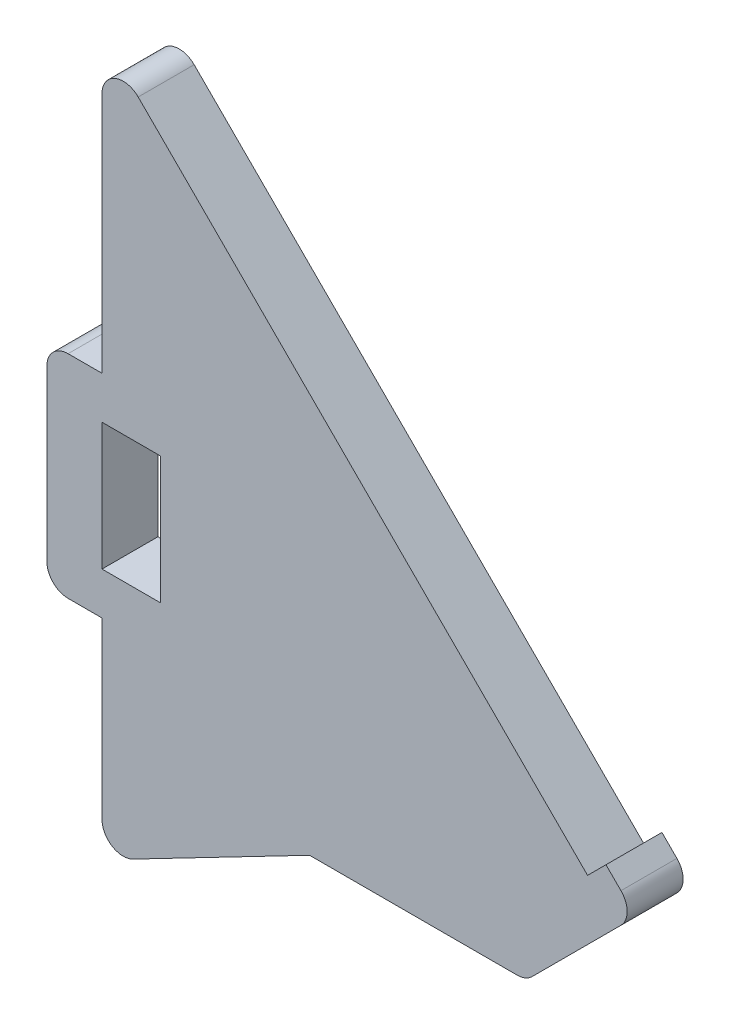
ISO-10303-21;
HEADER;
FILE_DESCRIPTION(('STEP AP214'),'2;1');
FILE_NAME('part.step','',(''),(''),'','','');
FILE_SCHEMA(('AUTOMOTIVE_DESIGN { 1 0 10303 214 1 1 1 1 }'));
ENDSEC;
DATA;
#1=APPLICATION_CONTEXT('core data for automotive mechanical design processes');
#2=APPLICATION_PROTOCOL_DEFINITION('international standard','automotive_design',2000,#1);
#3=PRODUCT_CONTEXT('',#1,'mechanical');
#4=PRODUCT('Part','Part','',(#3));
#5=PRODUCT_RELATED_PRODUCT_CATEGORY('part','',(#4));
#6=PRODUCT_DEFINITION_FORMATION('','',#4);
#7=PRODUCT_DEFINITION_CONTEXT('part definition',#1,'design');
#8=PRODUCT_DEFINITION('design','',#6,#7);
#9=PRODUCT_DEFINITION_SHAPE('','',#8);
#10=(LENGTH_UNIT() NAMED_UNIT(*) SI_UNIT(.MILLI.,.METRE.));
#11=(NAMED_UNIT(*) PLANE_ANGLE_UNIT() SI_UNIT($,.RADIAN.));
#12=(NAMED_UNIT(*) SI_UNIT($,.STERADIAN.) SOLID_ANGLE_UNIT());
#13=UNCERTAINTY_MEASURE_WITH_UNIT(LENGTH_MEASURE(1.E-05),#10,'distance_accuracy_value','');
#14=(GEOMETRIC_REPRESENTATION_CONTEXT(3) GLOBAL_UNCERTAINTY_ASSIGNED_CONTEXT((#13)) GLOBAL_UNIT_ASSIGNED_CONTEXT((#10,
#11,#12)) REPRESENTATION_CONTEXT('',''));
#15=CARTESIAN_POINT('',(0.,0.,0.));
#16=DIRECTION('',(0.,0.,1.));
#17=DIRECTION('',(1.,0.,0.));
#18=AXIS2_PLACEMENT_3D('',#15,#16,#17);
#19=CARTESIAN_POINT('',(-4.,-57.1223663641,6.6));
#20=DIRECTION('',(0.,0.,1.));
#21=DIRECTION('',(1.,0.,0.));
#22=AXIS2_PLACEMENT_3D('',#19,#20,#21);
#23=PLANE('',#22);
#24=CARTESIAN_POINT('',(-4.,-57.1223663641,6.6));
#25=DIRECTION('',(0.,0.,1.));
#26=DIRECTION('',(1.,0.,0.));
#27=AXIS2_PLACEMENT_3D('',#24,#25,#26);
#28=CIRCLE('',#27,2.5);
#29=CARTESIAN_POINT('',(-6.5,-57.1223663641,6.6));
#30=VERTEX_POINT('',#29);
#31=CARTESIAN_POINT('',(-4.,-59.6223663641,6.6));
#32=VERTEX_POINT('',#31);
#33=EDGE_CURVE('E212',#30,#32,#28,.T.);
#34=ORIENTED_EDGE('',*,*,#33,.T.);
#35=DIRECTION('',(1.,0.,0.));
#36=VECTOR('',#35,1.);
#37=CARTESIAN_POINT('',(0.,-59.6223663641,6.6));
#38=LINE('',#37,#36);
#39=CARTESIAN_POINT('',(0.,-59.6223663641,6.6));
#40=VERTEX_POINT('',#39);
#41=EDGE_CURVE('E215',#32,#40,#38,.T.);
#42=ORIENTED_EDGE('',*,*,#41,.T.);
#43=DIRECTION('',(0.,-1.,0.));
#44=VECTOR('',#43,1.);
#45=CARTESIAN_POINT('',(0.,-59.6223663641,6.6));
#46=LINE('',#45,#44);
#47=CARTESIAN_POINT('',(0.,-80.2091547881,6.6));
#48=VERTEX_POINT('',#47);
#49=EDGE_CURVE('E218',#40,#48,#46,.T.);
#50=ORIENTED_EDGE('',*,*,#49,.T.);
#51=CARTESIAN_POINT('',(2.50000000000002,-80.2091547881403,6.6));
#52=DIRECTION('',(0.,0.,1.));
#53=DIRECTION('',(1.,0.,0.));
#54=AXIS2_PLACEMENT_3D('',#51,#52,#53);
#55=CIRCLE('',#54,2.50000000000002);
#56=CARTESIAN_POINT('',(3.6511864286,-82.4283370264,6.6));
#57=VERTEX_POINT('',#56);
#58=EDGE_CURVE('E220',#48,#57,#55,.T.);
#59=ORIENTED_EDGE('',*,*,#58,.T.);
#60=DIRECTION('',(0.887672895301549,0.460474571444466,0.));
#61=VECTOR('',#60,1.);
#62=CARTESIAN_POINT('',(24.482233047,-71.6223663641,6.6));
#63=LINE('',#62,#61);
#64=CARTESIAN_POINT('',(24.482233047,-71.6223663641,6.6));
#65=VERTEX_POINT('',#64);
#66=EDGE_CURVE('E222',#57,#65,#63,.T.);
#67=ORIENTED_EDGE('',*,*,#66,.T.);
#68=DIRECTION('',(1.,0.,0.));
#69=VECTOR('',#68,1.);
#70=CARTESIAN_POINT('',(24.482233047,-71.6223663641,6.6));
#71=LINE('',#70,#69);
#72=CARTESIAN_POINT('',(48.9644660941,-71.6223663641,6.6));
#73=VERTEX_POINT('',#72);
#74=EDGE_CURVE('E224',#65,#73,#71,.T.);
#75=ORIENTED_EDGE('',*,*,#74,.T.);
#76=CARTESIAN_POINT('',(48.9644660940673,-69.1223663641001,6.6));
#77=DIRECTION('',(0.,0.,1.));
#78=DIRECTION('',(1.,0.,0.));
#79=AXIS2_PLACEMENT_3D('',#76,#77,#78);
#80=CIRCLE('',#79,2.49999999999995);
#81=CARTESIAN_POINT('',(50.732233047,-70.8901333171,6.6));
#82=VERTEX_POINT('',#81);
#83=EDGE_CURVE('E226',#73,#82,#80,.T.);
#84=ORIENTED_EDGE('',*,*,#83,.T.);
#85=DIRECTION('',(0.707106781186548,0.707106781186547,0.));
#86=VECTOR('',#85,1.);
#87=CARTESIAN_POINT('',(50.732233047,-70.8901333171,6.6));
#88=LINE('',#87,#86);
#89=CARTESIAN_POINT('',(61.2142340473,-60.4081323168,6.6));
#90=VERTEX_POINT('',#89);
#91=EDGE_CURVE('E228',#82,#90,#88,.T.);
#92=ORIENTED_EDGE('',*,*,#91,.T.);
#93=CARTESIAN_POINT('',(59.4464670943673,-58.6403653638,6.6));
#94=DIRECTION('',(0.,0.,1.));
#95=DIRECTION('',(1.,0.,0.));
#96=AXIS2_PLACEMENT_3D('',#93,#94,#95);
#97=CIRCLE('',#96,2.49999999999999);
#98=CARTESIAN_POINT('',(61.2142340473,-56.8725984108,6.6));
#99=VERTEX_POINT('',#98);
#100=EDGE_CURVE('E230',#90,#99,#97,.T.);
#101=ORIENTED_EDGE('',*,*,#100,.T.);
#102=DIRECTION('',(-0.707106781186548,0.707106781186548,0.));
#103=VECTOR('',#102,1.);
#104=CARTESIAN_POINT('',(61.2142340473,-56.8725984108,6.6));
#105=LINE('',#104,#103);
#106=CARTESIAN_POINT('',(59.4464670944,-55.1048314579,6.6));
#107=VERTEX_POINT('',#106);
#108=EDGE_CURVE('E232',#99,#107,#105,.T.);
#109=ORIENTED_EDGE('',*,*,#108,.T.);
#110=DIRECTION('',(-0.707106781202832,-0.707106781170263,0.));
#111=VECTOR('',#110,1.);
#112=CARTESIAN_POINT('',(59.4464670944,-55.1048314579,6.6));
#113=LINE('',#112,#111);
#114=CARTESIAN_POINT('',(57.2756492761,-57.2756492761,6.6));
#115=VERTEX_POINT('',#114);
#116=EDGE_CURVE('E234',#107,#115,#113,.T.);
#117=ORIENTED_EDGE('',*,*,#116,.T.);
#118=DIRECTION('',(-0.707106781186548,0.707106781186548,0.));
#119=VECTOR('',#118,1.);
#120=CARTESIAN_POINT('',(57.2756492761,-57.2756492761,6.6));
#121=LINE('',#120,#119);
#122=CARTESIAN_POINT('',(4.267766953,-4.267766953,6.6));
#123=VERTEX_POINT('',#122);
#124=EDGE_CURVE('E236',#115,#123,#121,.T.);
#125=ORIENTED_EDGE('',*,*,#124,.T.);
#126=CARTESIAN_POINT('',(2.5,-6.03553390593274,6.6));
#127=DIRECTION('',(0.,0.,1.));
#128=DIRECTION('',(1.,0.,0.));
#129=AXIS2_PLACEMENT_3D('',#126,#127,#128);
#130=CIRCLE('',#129,2.5);
#131=CARTESIAN_POINT('',(0.,-6.0355339059,6.6));
#132=VERTEX_POINT('',#131);
#133=EDGE_CURVE('E238',#123,#132,#130,.T.);
#134=ORIENTED_EDGE('',*,*,#133,.T.);
#135=DIRECTION('',(0.,-1.,0.));
#136=VECTOR('',#135,1.);
#137=CARTESIAN_POINT('',(0.,-6.0355339059,6.6));
#138=LINE('',#137,#136);
#139=CARTESIAN_POINT('',(0.,-34.6223663641,6.6));
#140=VERTEX_POINT('',#139);
#141=EDGE_CURVE('E240',#132,#140,#138,.T.);
#142=ORIENTED_EDGE('',*,*,#141,.T.);
#143=DIRECTION('',(-1.,0.,0.));
#144=VECTOR('',#143,1.);
#145=CARTESIAN_POINT('',(-4.,-34.6223663641,6.6));
#146=LINE('',#145,#144);
#147=CARTESIAN_POINT('',(-4.,-34.6223663641,6.6));
#148=VERTEX_POINT('',#147);
#149=EDGE_CURVE('E242',#140,#148,#146,.T.);
#150=ORIENTED_EDGE('',*,*,#149,.T.);
#151=CARTESIAN_POINT('',(-4.,-37.1223663641,6.6));
#152=DIRECTION('',(0.,0.,1.));
#153=DIRECTION('',(1.,0.,0.));
#154=AXIS2_PLACEMENT_3D('',#151,#152,#153);
#155=CIRCLE('',#154,2.5);
#156=CARTESIAN_POINT('',(-6.5,-37.1223663641,6.6));
#157=VERTEX_POINT('',#156);
#158=EDGE_CURVE('E244',#148,#157,#155,.T.);
#159=ORIENTED_EDGE('',*,*,#158,.T.);
#160=DIRECTION('',(0.,-1.,0.));
#161=VECTOR('',#160,1.);
#162=CARTESIAN_POINT('',(-6.5,-57.1223663641,6.6));
#163=LINE('',#162,#161);
#164=EDGE_CURVE('E246',#157,#30,#163,.T.);
#165=ORIENTED_EDGE('',*,*,#164,.T.);
#166=EDGE_LOOP('',(#34,#42,#50,#59,#67,#75,#84,#92,#101,#109,#117,#125,#134,#142,#150,#159,#165));
#167=FACE_BOUND('',#166,.T.);
#168=DIRECTION('',(-1.,0.,0.));
#169=VECTOR('',#168,1.);
#170=CARTESIAN_POINT('',(6.88,-39.6223663641,6.6));
#171=LINE('',#170,#169);
#172=CARTESIAN_POINT('',(6.88,-39.6223663641,6.6));
#173=VERTEX_POINT('',#172);
#174=CARTESIAN_POINT('',(0.,-39.6223663641,6.6));
#175=VERTEX_POINT('',#174);
#176=EDGE_CURVE('E184',#173,#175,#171,.T.);
#177=ORIENTED_EDGE('',*,*,#176,.F.);
#178=DIRECTION('',(0.,1.,0.));
#179=VECTOR('',#178,1.);
#180=CARTESIAN_POINT('',(6.88,-54.6223663641,6.6));
#181=LINE('',#180,#179);
#182=CARTESIAN_POINT('',(6.88,-54.6223663641,6.6));
#183=VERTEX_POINT('',#182);
#184=EDGE_CURVE('E176',#183,#173,#181,.T.);
#185=ORIENTED_EDGE('',*,*,#184,.F.);
#186=DIRECTION('',(1.,0.,0.));
#187=VECTOR('',#186,1.);
#188=CARTESIAN_POINT('',(0.,-54.6223663641,6.6));
#189=LINE('',#188,#187);
#190=CARTESIAN_POINT('',(0.,-54.6223663641,6.6));
#191=VERTEX_POINT('',#190);
#192=EDGE_CURVE('E198',#191,#183,#189,.T.);
#193=ORIENTED_EDGE('',*,*,#192,.F.);
#194=DIRECTION('',(0.,-1.,0.));
#195=VECTOR('',#194,1.);
#196=CARTESIAN_POINT('',(0.,-39.6223663641,6.6));
#197=LINE('',#196,#195);
#198=EDGE_CURVE('E196',#175,#191,#197,.T.);
#199=ORIENTED_EDGE('',*,*,#198,.F.);
#200=EDGE_LOOP('',(#177,#185,#193,#199));
#201=FACE_BOUND('',#200,.T.);
#202=ADVANCED_FACE('F33',(#167,#201),#23,.T.);
#203=CARTESIAN_POINT('',(-4.,-57.1223663641,0.));
#204=DIRECTION('',(0.,0.,1.));
#205=DIRECTION('',(1.,0.,0.));
#206=AXIS2_PLACEMENT_3D('',#203,#204,#205);
#207=PLANE('',#206);
#208=CARTESIAN_POINT('',(-4.,-57.1223663641,0.));
#209=DIRECTION('',(0.,0.,1.));
#210=DIRECTION('',(1.,0.,0.));
#211=AXIS2_PLACEMENT_3D('',#208,#209,#210);
#212=CIRCLE('',#211,2.5);
#213=CARTESIAN_POINT('',(-6.5,-57.1223663641,0.));
#214=VERTEX_POINT('',#213);
#215=CARTESIAN_POINT('',(-4.,-59.6223663641,0.));
#216=VERTEX_POINT('',#215);
#217=EDGE_CURVE('E192',#214,#216,#212,.T.);
#218=ORIENTED_EDGE('',*,*,#217,.F.);
#219=DIRECTION('',(0.,-1.,0.));
#220=VECTOR('',#219,1.);
#221=CARTESIAN_POINT('',(-6.5,-57.1223663641,0.));
#222=LINE('',#221,#220);
#223=CARTESIAN_POINT('',(-6.5,-37.1223663641,0.));
#224=VERTEX_POINT('',#223);
#225=EDGE_CURVE('E216',#224,#214,#222,.T.);
#226=ORIENTED_EDGE('',*,*,#225,.F.);
#227=CARTESIAN_POINT('',(-4.,-37.1223663641,0.));
#228=DIRECTION('',(0.,0.,1.));
#229=DIRECTION('',(1.,0.,0.));
#230=AXIS2_PLACEMENT_3D('',#227,#228,#229);
#231=CIRCLE('',#230,2.5);
#232=CARTESIAN_POINT('',(-4.,-34.6223663641,0.));
#233=VERTEX_POINT('',#232);
#234=EDGE_CURVE('E279',#233,#224,#231,.T.);
#235=ORIENTED_EDGE('',*,*,#234,.F.);
#236=DIRECTION('',(-1.,0.,0.));
#237=VECTOR('',#236,1.);
#238=CARTESIAN_POINT('',(-4.,-34.6223663641,0.));
#239=LINE('',#238,#237);
#240=CARTESIAN_POINT('',(0.,-34.6223663641,0.));
#241=VERTEX_POINT('',#240);
#242=EDGE_CURVE('E277',#241,#233,#239,.T.);
#243=ORIENTED_EDGE('',*,*,#242,.F.);
#244=DIRECTION('',(0.,-1.,0.));
#245=VECTOR('',#244,1.);
#246=CARTESIAN_POINT('',(0.,-6.0355339059,0.));
#247=LINE('',#246,#245);
#248=CARTESIAN_POINT('',(0.,-6.0355339059,0.));
#249=VERTEX_POINT('',#248);
#250=EDGE_CURVE('E275',#249,#241,#247,.T.);
#251=ORIENTED_EDGE('',*,*,#250,.F.);
#252=CARTESIAN_POINT('',(2.5,-6.03553390593274,0.));
#253=DIRECTION('',(0.,0.,1.));
#254=DIRECTION('',(1.,0.,0.));
#255=AXIS2_PLACEMENT_3D('',#252,#253,#254);
#256=CIRCLE('',#255,2.5);
#257=CARTESIAN_POINT('',(4.267766953,-4.267766953,0.));
#258=VERTEX_POINT('',#257);
#259=EDGE_CURVE('E273',#258,#249,#256,.T.);
#260=ORIENTED_EDGE('',*,*,#259,.F.);
#261=DIRECTION('',(-0.707106781186548,0.707106781186548,0.));
#262=VECTOR('',#261,1.);
#263=CARTESIAN_POINT('',(57.2756492761,-57.2756492761,0.));
#264=LINE('',#263,#262);
#265=CARTESIAN_POINT('',(57.2756492761,-57.2756492761,0.));
#266=VERTEX_POINT('',#265);
#267=EDGE_CURVE('E271',#266,#258,#264,.T.);
#268=ORIENTED_EDGE('',*,*,#267,.F.);
#269=DIRECTION('',(-0.707106781202832,-0.707106781170263,0.));
#270=VECTOR('',#269,1.);
#271=CARTESIAN_POINT('',(59.4464670944,-55.1048314579,0.));
#272=LINE('',#271,#270);
#273=CARTESIAN_POINT('',(59.4464670944,-55.1048314579,0.));
#274=VERTEX_POINT('',#273);
#275=EDGE_CURVE('E269',#274,#266,#272,.T.);
#276=ORIENTED_EDGE('',*,*,#275,.F.);
#277=DIRECTION('',(-0.707106781186548,0.707106781186548,0.));
#278=VECTOR('',#277,1.);
#279=CARTESIAN_POINT('',(61.2142340473,-56.8725984108,0.));
#280=LINE('',#279,#278);
#281=CARTESIAN_POINT('',(61.2142340473,-56.8725984108,0.));
#282=VERTEX_POINT('',#281);
#283=EDGE_CURVE('E267',#282,#274,#280,.T.);
#284=ORIENTED_EDGE('',*,*,#283,.F.);
#285=CARTESIAN_POINT('',(59.4464670943673,-58.6403653638,0.));
#286=DIRECTION('',(0.,0.,1.));
#287=DIRECTION('',(1.,0.,0.));
#288=AXIS2_PLACEMENT_3D('',#285,#286,#287);
#289=CIRCLE('',#288,2.49999999999999);
#290=CARTESIAN_POINT('',(61.2142340473,-60.4081323168,0.));
#291=VERTEX_POINT('',#290);
#292=EDGE_CURVE('E265',#291,#282,#289,.T.);
#293=ORIENTED_EDGE('',*,*,#292,.F.);
#294=DIRECTION('',(0.707106781186548,0.707106781186547,0.));
#295=VECTOR('',#294,1.);
#296=CARTESIAN_POINT('',(50.732233047,-70.8901333171,0.));
#297=LINE('',#296,#295);
#298=CARTESIAN_POINT('',(50.732233047,-70.8901333171,0.));
#299=VERTEX_POINT('',#298);
#300=EDGE_CURVE('E263',#299,#291,#297,.T.);
#301=ORIENTED_EDGE('',*,*,#300,.F.);
#302=CARTESIAN_POINT('',(48.9644660940673,-69.1223663641001,0.));
#303=DIRECTION('',(0.,0.,1.));
#304=DIRECTION('',(1.,0.,0.));
#305=AXIS2_PLACEMENT_3D('',#302,#303,#304);
#306=CIRCLE('',#305,2.49999999999995);
#307=CARTESIAN_POINT('',(48.9644660941,-71.6223663641,0.));
#308=VERTEX_POINT('',#307);
#309=EDGE_CURVE('E261',#308,#299,#306,.T.);
#310=ORIENTED_EDGE('',*,*,#309,.F.);
#311=DIRECTION('',(1.,0.,0.));
#312=VECTOR('',#311,1.);
#313=CARTESIAN_POINT('',(24.482233047,-71.6223663641,0.));
#314=LINE('',#313,#312);
#315=CARTESIAN_POINT('',(24.482233047,-71.6223663641,0.));
#316=VERTEX_POINT('',#315);
#317=EDGE_CURVE('E259',#316,#308,#314,.T.);
#318=ORIENTED_EDGE('',*,*,#317,.F.);
#319=DIRECTION('',(0.887672895301549,0.460474571444466,0.));
#320=VECTOR('',#319,1.);
#321=CARTESIAN_POINT('',(24.482233047,-71.6223663641,0.));
#322=LINE('',#321,#320);
#323=CARTESIAN_POINT('',(3.6511864286,-82.4283370264,0.));
#324=VERTEX_POINT('',#323);
#325=EDGE_CURVE('E257',#324,#316,#322,.T.);
#326=ORIENTED_EDGE('',*,*,#325,.F.);
#327=CARTESIAN_POINT('',(2.50000000000002,-80.2091547881403,0.));
#328=DIRECTION('',(0.,0.,1.));
#329=DIRECTION('',(1.,0.,0.));
#330=AXIS2_PLACEMENT_3D('',#327,#328,#329);
#331=CIRCLE('',#330,2.50000000000002);
#332=CARTESIAN_POINT('',(0.,-80.2091547881,0.));
#333=VERTEX_POINT('',#332);
#334=EDGE_CURVE('E255',#333,#324,#331,.T.);
#335=ORIENTED_EDGE('',*,*,#334,.F.);
#336=DIRECTION('',(0.,-1.,0.));
#337=VECTOR('',#336,1.);
#338=CARTESIAN_POINT('',(0.,-59.6223663641,0.));
#339=LINE('',#338,#337);
#340=CARTESIAN_POINT('',(0.,-59.6223663641,0.));
#341=VERTEX_POINT('',#340);
#342=EDGE_CURVE('E253',#341,#333,#339,.T.);
#343=ORIENTED_EDGE('',*,*,#342,.F.);
#344=DIRECTION('',(1.,0.,0.));
#345=VECTOR('',#344,1.);
#346=CARTESIAN_POINT('',(0.,-59.6223663641,0.));
#347=LINE('',#346,#345);
#348=EDGE_CURVE('E251',#216,#341,#347,.T.);
#349=ORIENTED_EDGE('',*,*,#348,.F.);
#350=EDGE_LOOP('',(#218,#226,#235,#243,#251,#260,#268,#276,#284,#293,#301,#310,#318,#326,#335,
#343,#349));
#351=FACE_BOUND('',#350,.T.);
#352=DIRECTION('',(0.,1.,0.));
#353=VECTOR('',#352,1.);
#354=CARTESIAN_POINT('',(6.88,-54.6223663641,0.));
#355=LINE('',#354,#353);
#356=CARTESIAN_POINT('',(6.88,-54.6223663641,0.));
#357=VERTEX_POINT('',#356);
#358=CARTESIAN_POINT('',(6.88,-39.6223663641,0.));
#359=VERTEX_POINT('',#358);
#360=EDGE_CURVE('E56',#357,#359,#355,.T.);
#361=ORIENTED_EDGE('',*,*,#360,.T.);
#362=DIRECTION('',(-1.,0.,0.));
#363=VECTOR('',#362,1.);
#364=CARTESIAN_POINT('',(6.88,-39.6223663641,0.));
#365=LINE('',#364,#363);
#366=CARTESIAN_POINT('',(0.,-39.6223663641,0.));
#367=VERTEX_POINT('',#366);
#368=EDGE_CURVE('E191',#359,#367,#365,.T.);
#369=ORIENTED_EDGE('',*,*,#368,.T.);
#370=DIRECTION('',(0.,-1.,0.));
#371=VECTOR('',#370,1.);
#372=CARTESIAN_POINT('',(0.,-39.6223663641,0.));
#373=LINE('',#372,#371);
#374=CARTESIAN_POINT('',(0.,-54.6223663641,0.));
#375=VERTEX_POINT('',#374);
#376=EDGE_CURVE('E204',#367,#375,#373,.T.);
#377=ORIENTED_EDGE('',*,*,#376,.T.);
#378=DIRECTION('',(1.,0.,0.));
#379=VECTOR('',#378,1.);
#380=CARTESIAN_POINT('',(0.,-54.6223663641,0.));
#381=LINE('',#380,#379);
#382=EDGE_CURVE('E185',#375,#357,#381,.T.);
#383=ORIENTED_EDGE('',*,*,#382,.T.);
#384=EDGE_LOOP('',(#361,#369,#377,#383));
#385=FACE_BOUND('',#384,.T.);
#386=ADVANCED_FACE('F336',(#351,#385),#207,.F.);
#387=CARTESIAN_POINT('',(-4.,-57.1223663641,6.6));
#388=DIRECTION('',(0.,0.,-1.));
#389=DIRECTION('',(-1.,0.,0.));
#390=AXIS2_PLACEMENT_3D('',#387,#388,#389);
#391=CYLINDRICAL_SURFACE('',#390,2.5);
#392=ORIENTED_EDGE('',*,*,#217,.T.);
#393=DIRECTION('',(0.,0.,-1.));
#394=VECTOR('',#393,1.);
#395=CARTESIAN_POINT('',(-4.,-59.6223663641,6.6));
#396=LINE('',#395,#394);
#397=EDGE_CURVE('E11',#32,#216,#396,.T.);
#398=ORIENTED_EDGE('',*,*,#397,.F.);
#399=ORIENTED_EDGE('',*,*,#33,.F.);
#400=DIRECTION('',(0.,0.,-1.));
#401=VECTOR('',#400,1.);
#402=CARTESIAN_POINT('',(-6.5,-57.1223663641,6.6));
#403=LINE('',#402,#401);
#404=EDGE_CURVE('E248',#30,#214,#403,.T.);
#405=ORIENTED_EDGE('',*,*,#404,.T.);
#406=EDGE_LOOP('',(#392,#398,#399,#405));
#407=FACE_BOUND('',#406,.T.);
#408=ADVANCED_FACE('F35',(#407),#391,.T.);
#409=CARTESIAN_POINT('',(0.,-59.6223663641,6.6));
#410=DIRECTION('',(0.,1.,0.));
#411=DIRECTION('',(0.,0.,1.));
#412=AXIS2_PLACEMENT_3D('',#409,#410,#411);
#413=PLANE('',#412);
#414=ORIENTED_EDGE('',*,*,#348,.T.);
#415=DIRECTION('',(0.,0.,-1.));
#416=VECTOR('',#415,1.);
#417=CARTESIAN_POINT('',(0.,-59.6223663641,6.6));
#418=LINE('',#417,#416);
#419=EDGE_CURVE('E41',#40,#341,#418,.T.);
#420=ORIENTED_EDGE('',*,*,#419,.F.);
#421=ORIENTED_EDGE('',*,*,#41,.F.);
#422=ORIENTED_EDGE('',*,*,#397,.T.);
#423=EDGE_LOOP('',(#414,#420,#421,#422));
#424=FACE_BOUND('',#423,.T.);
#425=ADVANCED_FACE('F353',(#424),#413,.F.);
#426=CARTESIAN_POINT('',(0.,-59.6223663641,6.6));
#427=DIRECTION('',(1.,0.,0.));
#428=DIRECTION('',(0.,0.,-1.));
#429=AXIS2_PLACEMENT_3D('',#426,#427,#428);
#430=PLANE('',#429);
#431=ORIENTED_EDGE('',*,*,#342,.T.);
#432=DIRECTION('',(0.,0.,-1.));
#433=VECTOR('',#432,1.);
#434=CARTESIAN_POINT('',(0.,-80.2091547881,6.6));
#435=LINE('',#434,#433);
#436=EDGE_CURVE('E323',#48,#333,#435,.T.);
#437=ORIENTED_EDGE('',*,*,#436,.F.);
#438=ORIENTED_EDGE('',*,*,#49,.F.);
#439=ORIENTED_EDGE('',*,*,#419,.T.);
#440=EDGE_LOOP('',(#431,#437,#438,#439));
#441=FACE_BOUND('',#440,.T.);
#442=ADVANCED_FACE('F330',(#441),#430,.F.);
#443=CARTESIAN_POINT('',(2.50000000000002,-80.2091547881403,6.6));
#444=DIRECTION('',(0.,0.,-1.));
#445=DIRECTION('',(-1.,0.,0.));
#446=AXIS2_PLACEMENT_3D('',#443,#444,#445);
#447=CYLINDRICAL_SURFACE('',#446,2.50000000000002);
#448=ORIENTED_EDGE('',*,*,#334,.T.);
#449=DIRECTION('',(0.,0.,-1.));
#450=VECTOR('',#449,1.);
#451=CARTESIAN_POINT('',(3.6511864286,-82.4283370264,6.6));
#452=LINE('',#451,#450);
#453=EDGE_CURVE('E320',#57,#324,#452,.T.);
#454=ORIENTED_EDGE('',*,*,#453,.F.);
#455=ORIENTED_EDGE('',*,*,#58,.F.);
#456=ORIENTED_EDGE('',*,*,#436,.T.);
#457=EDGE_LOOP('',(#448,#454,#455,#456));
#458=FACE_BOUND('',#457,.T.);
#459=ADVANCED_FACE('F342',(#458),#447,.T.);
#460=CARTESIAN_POINT('',(24.482233047,-71.6223663641,6.6));
#461=DIRECTION('',(-0.460474571444466,0.887672895301549,0.));
#462=DIRECTION('',(-0.887672895301549,-0.460474571444466,0.));
#463=AXIS2_PLACEMENT_3D('',#460,#461,#462);
#464=PLANE('',#463);
#465=ORIENTED_EDGE('',*,*,#325,.T.);
#466=DIRECTION('',(0.,0.,-1.));
#467=VECTOR('',#466,1.);
#468=CARTESIAN_POINT('',(24.482233047,-71.6223663641,6.6));
#469=LINE('',#468,#467);
#470=EDGE_CURVE('E317',#65,#316,#469,.T.);
#471=ORIENTED_EDGE('',*,*,#470,.F.);
#472=ORIENTED_EDGE('',*,*,#66,.F.);
#473=ORIENTED_EDGE('',*,*,#453,.T.);
#474=EDGE_LOOP('',(#465,#471,#472,#473));
#475=FACE_BOUND('',#474,.T.);
#476=ADVANCED_FACE('F346',(#475),#464,.F.);
#477=CARTESIAN_POINT('',(24.482233047,-71.6223663641,6.6));
#478=DIRECTION('',(0.,1.,0.));
#479=DIRECTION('',(0.,0.,1.));
#480=AXIS2_PLACEMENT_3D('',#477,#478,#479);
#481=PLANE('',#480);
#482=ORIENTED_EDGE('',*,*,#317,.T.);
#483=DIRECTION('',(0.,0.,-1.));
#484=VECTOR('',#483,1.);
#485=CARTESIAN_POINT('',(48.9644660941,-71.6223663641,6.6));
#486=LINE('',#485,#484);
#487=EDGE_CURVE('E314',#73,#308,#486,.T.);
#488=ORIENTED_EDGE('',*,*,#487,.F.);
#489=ORIENTED_EDGE('',*,*,#74,.F.);
#490=ORIENTED_EDGE('',*,*,#470,.T.);
#491=EDGE_LOOP('',(#482,#488,#489,#490));
#492=FACE_BOUND('',#491,.T.);
#493=ADVANCED_FACE('F411',(#492),#481,.F.);
#494=CARTESIAN_POINT('',(48.9644660940673,-69.1223663641001,6.6));
#495=DIRECTION('',(0.,0.,-1.));
#496=DIRECTION('',(-1.,0.,0.));
#497=AXIS2_PLACEMENT_3D('',#494,#495,#496);
#498=CYLINDRICAL_SURFACE('',#497,2.49999999999995);
#499=ORIENTED_EDGE('',*,*,#309,.T.);
#500=DIRECTION('',(0.,0.,-1.));
#501=VECTOR('',#500,1.);
#502=CARTESIAN_POINT('',(50.732233047,-70.8901333171,6.6));
#503=LINE('',#502,#501);
#504=EDGE_CURVE('E311',#82,#299,#503,.T.);
#505=ORIENTED_EDGE('',*,*,#504,.F.);
#506=ORIENTED_EDGE('',*,*,#83,.F.);
#507=ORIENTED_EDGE('',*,*,#487,.T.);
#508=EDGE_LOOP('',(#499,#505,#506,#507));
#509=FACE_BOUND('',#508,.T.);
#510=ADVANCED_FACE('F409',(#509),#498,.T.);
#511=CARTESIAN_POINT('',(50.732233047,-70.8901333171,6.6));
#512=DIRECTION('',(-0.707106781186547,0.707106781186548,0.));
#513=DIRECTION('',(-0.707106781186548,-0.707106781186547,0.));
#514=AXIS2_PLACEMENT_3D('',#511,#512,#513);
#515=PLANE('',#514);
#516=ORIENTED_EDGE('',*,*,#300,.T.);
#517=DIRECTION('',(0.,0.,-1.));
#518=VECTOR('',#517,1.);
#519=CARTESIAN_POINT('',(61.2142340473,-60.4081323168,6.6));
#520=LINE('',#519,#518);
#521=EDGE_CURVE('E308',#90,#291,#520,.T.);
#522=ORIENTED_EDGE('',*,*,#521,.F.);
#523=ORIENTED_EDGE('',*,*,#91,.F.);
#524=ORIENTED_EDGE('',*,*,#504,.T.);
#525=EDGE_LOOP('',(#516,#522,#523,#524));
#526=FACE_BOUND('',#525,.T.);
#527=ADVANCED_FACE('F404',(#526),#515,.F.);
#528=CARTESIAN_POINT('',(59.4464670943673,-58.6403653638,6.6));
#529=DIRECTION('',(0.,0.,-1.));
#530=DIRECTION('',(-1.,0.,0.));
#531=AXIS2_PLACEMENT_3D('',#528,#529,#530);
#532=CYLINDRICAL_SURFACE('',#531,2.49999999999999);
#533=ORIENTED_EDGE('',*,*,#292,.T.);
#534=DIRECTION('',(0.,0.,-1.));
#535=VECTOR('',#534,1.);
#536=CARTESIAN_POINT('',(61.2142340473,-56.8725984108,6.6));
#537=LINE('',#536,#535);
#538=EDGE_CURVE('E305',#99,#282,#537,.T.);
#539=ORIENTED_EDGE('',*,*,#538,.F.);
#540=ORIENTED_EDGE('',*,*,#100,.F.);
#541=ORIENTED_EDGE('',*,*,#521,.T.);
#542=EDGE_LOOP('',(#533,#539,#540,#541));
#543=FACE_BOUND('',#542,.T.);
#544=ADVANCED_FACE('F399',(#543),#532,.T.);
#545=CARTESIAN_POINT('',(61.2142340473,-56.8725984108,6.6));
#546=DIRECTION('',(-0.707106781186548,-0.707106781186548,0.));
#547=DIRECTION('',(0.707106781186548,-0.707106781186548,0.));
#548=AXIS2_PLACEMENT_3D('',#545,#546,#547);
#549=PLANE('',#548);
#550=ORIENTED_EDGE('',*,*,#283,.T.);
#551=DIRECTION('',(0.,0.,-1.));
#552=VECTOR('',#551,1.);
#553=CARTESIAN_POINT('',(59.4464670944,-55.1048314579,6.6));
#554=LINE('',#553,#552);
#555=EDGE_CURVE('E302',#107,#274,#554,.T.);
#556=ORIENTED_EDGE('',*,*,#555,.F.);
#557=ORIENTED_EDGE('',*,*,#108,.F.);
#558=ORIENTED_EDGE('',*,*,#538,.T.);
#559=EDGE_LOOP('',(#550,#556,#557,#558));
#560=FACE_BOUND('',#559,.T.);
#561=ADVANCED_FACE('F395',(#560),#549,.F.);
#562=CARTESIAN_POINT('',(59.4464670944,-55.1048314579,6.6));
#563=DIRECTION('',(0.707106781170263,-0.707106781202832,0.));
#564=DIRECTION('',(0.707106781202832,0.707106781170263,0.));
#565=AXIS2_PLACEMENT_3D('',#562,#563,#564);
#566=PLANE('',#565);
#567=ORIENTED_EDGE('',*,*,#275,.T.);
#568=DIRECTION('',(0.,0.,-1.));
#569=VECTOR('',#568,1.);
#570=CARTESIAN_POINT('',(57.2756492761,-57.2756492761,6.6));
#571=LINE('',#570,#569);
#572=EDGE_CURVE('E299',#115,#266,#571,.T.);
#573=ORIENTED_EDGE('',*,*,#572,.F.);
#574=ORIENTED_EDGE('',*,*,#116,.F.);
#575=ORIENTED_EDGE('',*,*,#555,.T.);
#576=EDGE_LOOP('',(#567,#573,#574,#575));
#577=FACE_BOUND('',#576,.T.);
#578=ADVANCED_FACE('F390',(#577),#566,.F.);
#579=CARTESIAN_POINT('',(57.2756492761,-57.2756492761,6.6));
#580=DIRECTION('',(-0.707106781186548,-0.707106781186548,0.));
#581=DIRECTION('',(0.707106781186548,-0.707106781186548,0.));
#582=AXIS2_PLACEMENT_3D('',#579,#580,#581);
#583=PLANE('',#582);
#584=ORIENTED_EDGE('',*,*,#267,.T.);
#585=DIRECTION('',(0.,0.,-1.));
#586=VECTOR('',#585,1.);
#587=CARTESIAN_POINT('',(4.267766953,-4.267766953,6.6));
#588=LINE('',#587,#586);
#589=EDGE_CURVE('E296',#123,#258,#588,.T.);
#590=ORIENTED_EDGE('',*,*,#589,.F.);
#591=ORIENTED_EDGE('',*,*,#124,.F.);
#592=ORIENTED_EDGE('',*,*,#572,.T.);
#593=EDGE_LOOP('',(#584,#590,#591,#592));
#594=FACE_BOUND('',#593,.T.);
#595=ADVANCED_FACE('F384',(#594),#583,.F.);
#596=CARTESIAN_POINT('',(2.5,-6.03553390593274,6.6));
#597=DIRECTION('',(0.,0.,-1.));
#598=DIRECTION('',(-1.,0.,0.));
#599=AXIS2_PLACEMENT_3D('',#596,#597,#598);
#600=CYLINDRICAL_SURFACE('',#599,2.5);
#601=ORIENTED_EDGE('',*,*,#259,.T.);
#602=DIRECTION('',(0.,0.,-1.));
#603=VECTOR('',#602,1.);
#604=CARTESIAN_POINT('',(0.,-6.0355339059,6.6));
#605=LINE('',#604,#603);
#606=EDGE_CURVE('E293',#132,#249,#605,.T.);
#607=ORIENTED_EDGE('',*,*,#606,.F.);
#608=ORIENTED_EDGE('',*,*,#133,.F.);
#609=ORIENTED_EDGE('',*,*,#589,.T.);
#610=EDGE_LOOP('',(#601,#607,#608,#609));
#611=FACE_BOUND('',#610,.T.);
#612=ADVANCED_FACE('F380',(#611),#600,.T.);
#613=CARTESIAN_POINT('',(0.,-6.0355339059,6.6));
#614=DIRECTION('',(1.,0.,0.));
#615=DIRECTION('',(0.,0.,-1.));
#616=AXIS2_PLACEMENT_3D('',#613,#614,#615);
#617=PLANE('',#616);
#618=ORIENTED_EDGE('',*,*,#250,.T.);
#619=DIRECTION('',(0.,0.,-1.));
#620=VECTOR('',#619,1.);
#621=CARTESIAN_POINT('',(0.,-34.6223663641,6.6));
#622=LINE('',#621,#620);
#623=EDGE_CURVE('E290',#140,#241,#622,.T.);
#624=ORIENTED_EDGE('',*,*,#623,.F.);
#625=ORIENTED_EDGE('',*,*,#141,.F.);
#626=ORIENTED_EDGE('',*,*,#606,.T.);
#627=EDGE_LOOP('',(#618,#624,#625,#626));
#628=FACE_BOUND('',#627,.T.);
#629=ADVANCED_FACE('F375',(#628),#617,.F.);
#630=CARTESIAN_POINT('',(-4.,-34.6223663641,6.6));
#631=DIRECTION('',(0.,-1.,0.));
#632=DIRECTION('',(0.,0.,-1.));
#633=AXIS2_PLACEMENT_3D('',#630,#631,#632);
#634=PLANE('',#633);
#635=ORIENTED_EDGE('',*,*,#242,.T.);
#636=DIRECTION('',(0.,0.,-1.));
#637=VECTOR('',#636,1.);
#638=CARTESIAN_POINT('',(-4.,-34.6223663641,6.6));
#639=LINE('',#638,#637);
#640=EDGE_CURVE('E287',#148,#233,#639,.T.);
#641=ORIENTED_EDGE('',*,*,#640,.F.);
#642=ORIENTED_EDGE('',*,*,#149,.F.);
#643=ORIENTED_EDGE('',*,*,#623,.T.);
#644=EDGE_LOOP('',(#635,#641,#642,#643));
#645=FACE_BOUND('',#644,.T.);
#646=ADVANCED_FACE('F369',(#645),#634,.F.);
#647=CARTESIAN_POINT('',(-4.,-37.1223663641,6.6));
#648=DIRECTION('',(0.,0.,-1.));
#649=DIRECTION('',(-1.,0.,0.));
#650=AXIS2_PLACEMENT_3D('',#647,#648,#649);
#651=CYLINDRICAL_SURFACE('',#650,2.5);
#652=ORIENTED_EDGE('',*,*,#234,.T.);
#653=DIRECTION('',(0.,0.,-1.));
#654=VECTOR('',#653,1.);
#655=CARTESIAN_POINT('',(-6.5,-37.1223663641,6.6));
#656=LINE('',#655,#654);
#657=EDGE_CURVE('E284',#157,#224,#656,.T.);
#658=ORIENTED_EDGE('',*,*,#657,.F.);
#659=ORIENTED_EDGE('',*,*,#158,.F.);
#660=ORIENTED_EDGE('',*,*,#640,.T.);
#661=EDGE_LOOP('',(#652,#658,#659,#660));
#662=FACE_BOUND('',#661,.T.);
#663=ADVANCED_FACE('F365',(#662),#651,.T.);
#664=CARTESIAN_POINT('',(-6.5,-57.1223663641,6.6));
#665=DIRECTION('',(1.,0.,0.));
#666=DIRECTION('',(0.,0.,-1.));
#667=AXIS2_PLACEMENT_3D('',#664,#665,#666);
#668=PLANE('',#667);
#669=ORIENTED_EDGE('',*,*,#225,.T.);
#670=ORIENTED_EDGE('',*,*,#404,.F.);
#671=ORIENTED_EDGE('',*,*,#164,.F.);
#672=ORIENTED_EDGE('',*,*,#657,.T.);
#673=EDGE_LOOP('',(#669,#670,#671,#672));
#674=FACE_BOUND('',#673,.T.);
#675=ADVANCED_FACE('F360',(#674),#668,.F.);
#676=CARTESIAN_POINT('',(6.88,-54.6223663641,6.6));
#677=DIRECTION('',(-1.,0.,0.));
#678=DIRECTION('',(0.,0.,1.));
#679=AXIS2_PLACEMENT_3D('',#676,#677,#678);
#680=PLANE('',#679);
#681=ORIENTED_EDGE('',*,*,#360,.F.);
#682=DIRECTION('',(0.,0.,-1.));
#683=VECTOR('',#682,1.);
#684=CARTESIAN_POINT('',(6.88,-54.6223663641,6.6));
#685=LINE('',#684,#683);
#686=EDGE_CURVE('E180',#183,#357,#685,.T.);
#687=ORIENTED_EDGE('',*,*,#686,.F.);
#688=ORIENTED_EDGE('',*,*,#184,.T.);
#689=DIRECTION('',(0.,0.,-1.));
#690=VECTOR('',#689,1.);
#691=CARTESIAN_POINT('',(6.88,-39.6223663641,6.6));
#692=LINE('',#691,#690);
#693=EDGE_CURVE('E179',#173,#359,#692,.T.);
#694=ORIENTED_EDGE('',*,*,#693,.T.);
#695=EDGE_LOOP('',(#681,#687,#688,#694));
#696=FACE_BOUND('',#695,.T.);
#697=ADVANCED_FACE('F178',(#696),#680,.T.);
#698=CARTESIAN_POINT('',(6.88,-39.6223663641,6.6));
#699=DIRECTION('',(0.,-1.,0.));
#700=DIRECTION('',(0.,0.,-1.));
#701=AXIS2_PLACEMENT_3D('',#698,#699,#700);
#702=PLANE('',#701);
#703=ORIENTED_EDGE('',*,*,#368,.F.);
#704=ORIENTED_EDGE('',*,*,#693,.F.);
#705=ORIENTED_EDGE('',*,*,#176,.T.);
#706=DIRECTION('',(0.,0.,-1.));
#707=VECTOR('',#706,1.);
#708=CARTESIAN_POINT('',(0.,-39.6223663641,6.6));
#709=LINE('',#708,#707);
#710=EDGE_CURVE('E193',#175,#367,#709,.T.);
#711=ORIENTED_EDGE('',*,*,#710,.T.);
#712=EDGE_LOOP('',(#703,#704,#705,#711));
#713=FACE_BOUND('',#712,.T.);
#714=ADVANCED_FACE('F188',(#713),#702,.T.);
#715=CARTESIAN_POINT('',(0.,-39.6223663641,6.6));
#716=DIRECTION('',(1.,0.,0.));
#717=DIRECTION('',(0.,0.,-1.));
#718=AXIS2_PLACEMENT_3D('',#715,#716,#717);
#719=PLANE('',#718);
#720=ORIENTED_EDGE('',*,*,#376,.F.);
#721=ORIENTED_EDGE('',*,*,#710,.F.);
#722=ORIENTED_EDGE('',*,*,#198,.T.);
#723=DIRECTION('',(0.,0.,-1.));
#724=VECTOR('',#723,1.);
#725=CARTESIAN_POINT('',(0.,-54.6223663641,6.6));
#726=LINE('',#725,#724);
#727=EDGE_CURVE('E48',#191,#375,#726,.T.);
#728=ORIENTED_EDGE('',*,*,#727,.T.);
#729=EDGE_LOOP('',(#720,#721,#722,#728));
#730=FACE_BOUND('',#729,.T.);
#731=ADVANCED_FACE('F499',(#730),#719,.T.);
#732=CARTESIAN_POINT('',(0.,-54.6223663641,6.6));
#733=DIRECTION('',(0.,1.,0.));
#734=DIRECTION('',(0.,0.,1.));
#735=AXIS2_PLACEMENT_3D('',#732,#733,#734);
#736=PLANE('',#735);
#737=ORIENTED_EDGE('',*,*,#382,.F.);
#738=ORIENTED_EDGE('',*,*,#727,.F.);
#739=ORIENTED_EDGE('',*,*,#192,.T.);
#740=ORIENTED_EDGE('',*,*,#686,.T.);
#741=EDGE_LOOP('',(#737,#738,#739,#740));
#742=FACE_BOUND('',#741,.T.);
#743=ADVANCED_FACE('F505',(#742),#736,.T.);
#744=CLOSED_SHELL('',(#202,#386,#408,#425,#442,#459,#476,#493,#510,#527,#544,#561,#578,#595,
#612,#629,#646,#663,#675,#697,#714,#731,#743));
#745=MANIFOLD_SOLID_BREP('B2',#744);
#746=ADVANCED_BREP_SHAPE_REPRESENTATION('',(#18,#745),#14);
#747=SHAPE_DEFINITION_REPRESENTATION(#9,#746);
ENDSEC;
END-ISO-10303-21;
